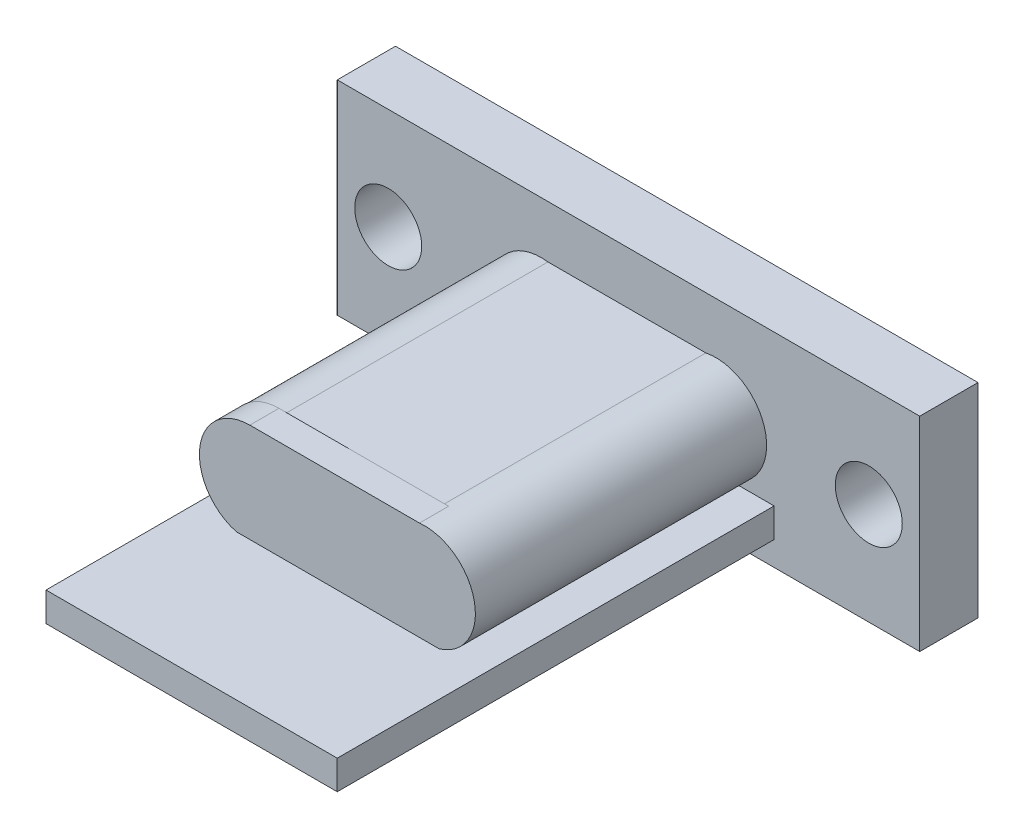
ISO-10303-21;
HEADER;
FILE_DESCRIPTION(('STEP AP214'),'2;1');
FILE_NAME('part.step','',(''),(''),'','','');
FILE_SCHEMA(('AUTOMOTIVE_DESIGN { 1 0 10303 214 1 1 1 1 }'));
ENDSEC;
DATA;
#1=APPLICATION_CONTEXT('core data for automotive mechanical design processes');
#2=APPLICATION_PROTOCOL_DEFINITION('international standard','automotive_design',2000,#1);
#3=PRODUCT_CONTEXT('',#1,'mechanical');
#4=PRODUCT('Part','Part','',(#3));
#5=PRODUCT_RELATED_PRODUCT_CATEGORY('part','',(#4));
#6=PRODUCT_DEFINITION_FORMATION('','',#4);
#7=PRODUCT_DEFINITION_CONTEXT('part definition',#1,'design');
#8=PRODUCT_DEFINITION('design','',#6,#7);
#9=PRODUCT_DEFINITION_SHAPE('','',#8);
#10=(LENGTH_UNIT() NAMED_UNIT(*) SI_UNIT(.MILLI.,.METRE.));
#11=(NAMED_UNIT(*) PLANE_ANGLE_UNIT() SI_UNIT($,.RADIAN.));
#12=(NAMED_UNIT(*) SI_UNIT($,.STERADIAN.) SOLID_ANGLE_UNIT());
#13=UNCERTAINTY_MEASURE_WITH_UNIT(LENGTH_MEASURE(1.E-05),#10,'distance_accuracy_value','');
#14=(GEOMETRIC_REPRESENTATION_CONTEXT(3) GLOBAL_UNCERTAINTY_ASSIGNED_CONTEXT((#13)) GLOBAL_UNIT_ASSIGNED_CONTEXT((#10,
#11,#12)) REPRESENTATION_CONTEXT('',''));
#15=CARTESIAN_POINT('',(0.,0.,0.));
#16=DIRECTION('',(0.,0.,1.));
#17=DIRECTION('',(1.,0.,0.));
#18=AXIS2_PLACEMENT_3D('',#15,#16,#17);
#19=CARTESIAN_POINT('',(7.,3.5,12.));
#20=DIRECTION('',(0.,0.,-1.));
#21=DIRECTION('',(-1.,0.,0.));
#22=AXIS2_PLACEMENT_3D('',#19,#20,#21);
#23=CYLINDRICAL_SURFACE('',#22,1.7179151626522);
#24=CARTESIAN_POINT('',(7.,3.5,11.));
#25=DIRECTION('',(0.,0.,1.));
#26=DIRECTION('',(1.,0.,0.));
#27=AXIS2_PLACEMENT_3D('',#24,#25,#26);
#28=CIRCLE('',#27,1.7179151626522);
#29=CARTESIAN_POINT('',(7.23314436267465,5.20202121379945,11.));
#30=VERTEX_POINT('',#29);
#31=CARTESIAN_POINT('',(6.59377962061956,1.8308033341016,11.));
#32=VERTEX_POINT('',#31);
#33=EDGE_CURVE('E272',#30,#32,#28,.T.);
#34=ORIENTED_EDGE('',*,*,#33,.F.);
#35=DIRECTION('',(0.,0.,-1.));
#36=VECTOR('',#35,1.);
#37=CARTESIAN_POINT('',(7.23314436267465,5.20202121379945,12.));
#38=LINE('',#37,#36);
#39=CARTESIAN_POINT('',(7.23314436267465,5.20202121379945,2.));
#40=VERTEX_POINT('',#39);
#41=EDGE_CURVE('E66',#30,#40,#38,.T.);
#42=ORIENTED_EDGE('',*,*,#41,.T.);
#43=CARTESIAN_POINT('',(7.,3.5,2.));
#44=DIRECTION('',(0.,0.,1.));
#45=DIRECTION('',(1.,0.,0.));
#46=AXIS2_PLACEMENT_3D('',#43,#44,#45);
#47=CIRCLE('',#46,1.7179151626522);
#48=CARTESIAN_POINT('',(6.59377962061956,1.8308033341016,2.));
#49=VERTEX_POINT('',#48);
#50=EDGE_CURVE('E307',#40,#49,#47,.T.);
#51=ORIENTED_EDGE('',*,*,#50,.T.);
#52=DIRECTION('',(0.,0.,-1.));
#53=VECTOR('',#52,1.);
#54=CARTESIAN_POINT('',(6.59377962061956,1.8308033341016,12.));
#55=LINE('',#54,#53);
#56=EDGE_CURVE('E358',#32,#49,#55,.T.);
#57=ORIENTED_EDGE('',*,*,#56,.F.);
#58=EDGE_LOOP('',(#34,#42,#51,#57));
#59=FACE_BOUND('',#58,.T.);
#60=ADVANCED_FACE('F44',(#59),#23,.T.);
#61=CARTESIAN_POINT('',(7.23314436267465,5.20202121379945,12.));
#62=DIRECTION('',(0.00101570335021365,-0.999999484173219,0.));
#63=DIRECTION('',(0.999999484173219,0.00101570335021365,0.));
#64=AXIS2_PLACEMENT_3D('',#61,#62,#63);
#65=PLANE('',#64);
#66=DIRECTION('',(-0.999999484173219,-0.00101570335021365,0.));
#67=VECTOR('',#66,1.);
#68=CARTESIAN_POINT('',(7.23314436267465,5.20202121379945,11.));
#69=LINE('',#68,#67);
#70=CARTESIAN_POINT('',(12.654720999838,5.20752793019377,11.));
#71=VERTEX_POINT('',#70);
#72=EDGE_CURVE('E270',#71,#30,#69,.T.);
#73=ORIENTED_EDGE('',*,*,#72,.F.);
#74=DIRECTION('',(0.,0.,-1.));
#75=VECTOR('',#74,1.);
#76=CARTESIAN_POINT('',(12.654720999838,5.20752793019377,12.));
#77=LINE('',#76,#75);
#78=CARTESIAN_POINT('',(12.654720999838,5.20752793019377,2.));
#79=VERTEX_POINT('',#78);
#80=EDGE_CURVE('E343',#71,#79,#77,.T.);
#81=ORIENTED_EDGE('',*,*,#80,.T.);
#82=DIRECTION('',(-0.999999484173219,-0.00101570335021365,0.));
#83=VECTOR('',#82,1.);
#84=CARTESIAN_POINT('',(7.23314436267465,5.20202121379945,2.));
#85=LINE('',#84,#83);
#86=EDGE_CURVE('E315',#79,#40,#85,.T.);
#87=ORIENTED_EDGE('',*,*,#86,.T.);
#88=ORIENTED_EDGE('',*,*,#41,.F.);
#89=EDGE_LOOP('',(#73,#81,#87,#88));
#90=FACE_BOUND('',#89,.T.);
#91=ADVANCED_FACE('F487',(#90),#65,.F.);
#92=CARTESIAN_POINT('',(7.,3.5,12.));
#93=DIRECTION('',(0.,0.,-1.));
#94=DIRECTION('',(-1.,0.,0.));
#95=AXIS2_PLACEMENT_3D('',#92,#93,#94);
#96=CYLINDRICAL_SURFACE('',#95,1.27);
#97=DIRECTION('',(0.,0.,-1.));
#98=VECTOR('',#97,1.);
#99=CARTESIAN_POINT('',(7.,4.77,12.));
#100=LINE('',#99,#98);
#101=CARTESIAN_POINT('',(7.,4.77,11.));
#102=VERTEX_POINT('',#101);
#103=CARTESIAN_POINT('',(7.,4.77,2.));
#104=VERTEX_POINT('',#103);
#105=EDGE_CURVE('E293',#102,#104,#100,.T.);
#106=ORIENTED_EDGE('',*,*,#105,.F.);
#107=CARTESIAN_POINT('',(7.,3.5,11.));
#108=DIRECTION('',(0.,0.,1.));
#109=DIRECTION('',(1.,0.,0.));
#110=AXIS2_PLACEMENT_3D('',#107,#108,#109);
#111=CIRCLE('',#110,1.27);
#112=CARTESIAN_POINT('',(7.,2.23,11.));
#113=VERTEX_POINT('',#112);
#114=EDGE_CURVE('E65',#102,#113,#111,.T.);
#115=ORIENTED_EDGE('',*,*,#114,.T.);
#116=DIRECTION('',(0.,0.,-1.));
#117=VECTOR('',#116,1.);
#118=CARTESIAN_POINT('',(7.,2.23,12.));
#119=LINE('',#118,#117);
#120=CARTESIAN_POINT('',(7.,2.23,2.));
#121=VERTEX_POINT('',#120);
#122=EDGE_CURVE('E305',#113,#121,#119,.T.);
#123=ORIENTED_EDGE('',*,*,#122,.T.);
#124=CARTESIAN_POINT('',(7.,3.5,2.));
#125=DIRECTION('',(0.,0.,1.));
#126=DIRECTION('',(1.,0.,0.));
#127=AXIS2_PLACEMENT_3D('',#124,#125,#126);
#128=CIRCLE('',#127,1.27);
#129=EDGE_CURVE('E276',#104,#121,#128,.T.);
#130=ORIENTED_EDGE('',*,*,#129,.F.);
#131=EDGE_LOOP('',(#106,#115,#123,#130));
#132=FACE_BOUND('',#131,.T.);
#133=ADVANCED_FACE('F511',(#132),#96,.F.);
#134=CARTESIAN_POINT('',(7.,2.23,12.));
#135=DIRECTION('',(0.,1.,0.));
#136=DIRECTION('',(0.,0.,1.));
#137=AXIS2_PLACEMENT_3D('',#134,#135,#136);
#138=PLANE('',#137);
#139=ORIENTED_EDGE('',*,*,#122,.F.);
#140=DIRECTION('',(1.,0.,0.));
#141=VECTOR('',#140,1.);
#142=CARTESIAN_POINT('',(7.,2.23,11.));
#143=LINE('',#142,#141);
#144=CARTESIAN_POINT('',(13.,2.23,11.));
#145=VERTEX_POINT('',#144);
#146=EDGE_CURVE('E261',#113,#145,#143,.T.);
#147=ORIENTED_EDGE('',*,*,#146,.T.);
#148=DIRECTION('',(0.,0.,-1.));
#149=VECTOR('',#148,1.);
#150=CARTESIAN_POINT('',(13.,2.23,12.));
#151=LINE('',#150,#149);
#152=CARTESIAN_POINT('',(13.,2.23,2.));
#153=VERTEX_POINT('',#152);
#154=EDGE_CURVE('E303',#145,#153,#151,.T.);
#155=ORIENTED_EDGE('',*,*,#154,.T.);
#156=DIRECTION('',(1.,0.,0.));
#157=VECTOR('',#156,1.);
#158=CARTESIAN_POINT('',(7.,2.23,2.));
#159=LINE('',#158,#157);
#160=EDGE_CURVE('E281',#121,#153,#159,.T.);
#161=ORIENTED_EDGE('',*,*,#160,.F.);
#162=EDGE_LOOP('',(#139,#147,#155,#161));
#163=FACE_BOUND('',#162,.T.);
#164=ADVANCED_FACE('F610',(#163),#138,.T.);
#165=CARTESIAN_POINT('',(13.,3.5,12.));
#166=DIRECTION('',(0.,0.,-1.));
#167=DIRECTION('',(-1.,0.,0.));
#168=AXIS2_PLACEMENT_3D('',#165,#166,#167);
#169=CYLINDRICAL_SURFACE('',#168,1.27);
#170=ORIENTED_EDGE('',*,*,#154,.F.);
#171=CARTESIAN_POINT('',(13.,3.5,11.));
#172=DIRECTION('',(0.,0.,1.));
#173=DIRECTION('',(1.,0.,0.));
#174=AXIS2_PLACEMENT_3D('',#171,#172,#173);
#175=CIRCLE('',#174,1.27);
#176=CARTESIAN_POINT('',(13.,4.77,11.));
#177=VERTEX_POINT('',#176);
#178=EDGE_CURVE('E260',#145,#177,#175,.T.);
#179=ORIENTED_EDGE('',*,*,#178,.T.);
#180=DIRECTION('',(0.,0.,-1.));
#181=VECTOR('',#180,1.);
#182=CARTESIAN_POINT('',(13.,4.77,12.));
#183=LINE('',#182,#181);
#184=CARTESIAN_POINT('',(13.,4.77,2.));
#185=VERTEX_POINT('',#184);
#186=EDGE_CURVE('E296',#177,#185,#183,.T.);
#187=ORIENTED_EDGE('',*,*,#186,.T.);
#188=CARTESIAN_POINT('',(13.,3.5,2.));
#189=DIRECTION('',(0.,0.,1.));
#190=DIRECTION('',(1.,0.,0.));
#191=AXIS2_PLACEMENT_3D('',#188,#189,#190);
#192=CIRCLE('',#191,1.27);
#193=EDGE_CURVE('E289',#153,#185,#192,.T.);
#194=ORIENTED_EDGE('',*,*,#193,.F.);
#195=EDGE_LOOP('',(#170,#179,#187,#194));
#196=FACE_BOUND('',#195,.T.);
#197=ADVANCED_FACE('F582',(#196),#169,.F.);
#198=CARTESIAN_POINT('',(7.,4.77,12.));
#199=DIRECTION('',(0.,-1.,0.));
#200=DIRECTION('',(0.,0.,-1.));
#201=AXIS2_PLACEMENT_3D('',#198,#199,#200);
#202=PLANE('',#201);
#203=ORIENTED_EDGE('',*,*,#186,.F.);
#204=DIRECTION('',(-1.,0.,0.));
#205=VECTOR('',#204,1.);
#206=CARTESIAN_POINT('',(7.,4.77,11.));
#207=LINE('',#206,#205);
#208=EDGE_CURVE('E458',#177,#102,#207,.T.);
#209=ORIENTED_EDGE('',*,*,#208,.T.);
#210=ORIENTED_EDGE('',*,*,#105,.T.);
#211=DIRECTION('',(-1.,0.,0.));
#212=VECTOR('',#211,1.);
#213=CARTESIAN_POINT('',(7.,4.77,2.));
#214=LINE('',#213,#212);
#215=EDGE_CURVE('E292',#185,#104,#214,.T.);
#216=ORIENTED_EDGE('',*,*,#215,.F.);
#217=EDGE_LOOP('',(#203,#209,#210,#216));
#218=FACE_BOUND('',#217,.T.);
#219=ADVANCED_FACE('F579',(#218),#202,.T.);
#220=CARTESIAN_POINT('',(0.,0.,2.));
#221=DIRECTION('',(0.,0.,-1.));
#222=DIRECTION('',(-1.,0.,0.));
#223=AXIS2_PLACEMENT_3D('',#220,#221,#222);
#224=PLANE('',#223);
#225=CARTESIAN_POINT('',(18.25,3.5,2.));
#226=DIRECTION('',(0.,0.,1.));
#227=DIRECTION('',(1.,0.,0.));
#228=AXIS2_PLACEMENT_3D('',#225,#226,#227);
#229=CIRCLE('',#228,1.15);
#230=CARTESIAN_POINT('',(19.4,3.5,2.));
#231=VERTEX_POINT('',#230);
#232=EDGE_CURVE('E401',#231,#231,#229,.T.);
#233=ORIENTED_EDGE('',*,*,#232,.F.);
#234=EDGE_LOOP('',(#233));
#235=FACE_BOUND('',#234,.T.);
#236=CARTESIAN_POINT('',(1.75,3.5,2.));
#237=DIRECTION('',(0.,0.,1.));
#238=DIRECTION('',(1.,0.,0.));
#239=AXIS2_PLACEMENT_3D('',#236,#237,#238);
#240=CIRCLE('',#239,1.15);
#241=CARTESIAN_POINT('',(2.9,3.5,2.));
#242=VERTEX_POINT('',#241);
#243=EDGE_CURVE('E413',#242,#242,#240,.T.);
#244=ORIENTED_EDGE('',*,*,#243,.F.);
#245=EDGE_LOOP('',(#244));
#246=FACE_BOUND('',#245,.T.);
#247=DIRECTION('',(0.,-1.,0.));
#248=VECTOR('',#247,1.);
#249=CARTESIAN_POINT('',(0.,0.,2.));
#250=LINE('',#249,#248);
#251=CARTESIAN_POINT('',(0.,7.,2.));
#252=VERTEX_POINT('',#251);
#253=CARTESIAN_POINT('',(0.,0.,2.));
#254=VERTEX_POINT('',#253);
#255=EDGE_CURVE('E420',#252,#254,#250,.T.);
#256=ORIENTED_EDGE('',*,*,#255,.T.);
#257=DIRECTION('',(1.,0.,0.));
#258=VECTOR('',#257,1.);
#259=CARTESIAN_POINT('',(0.,0.,2.));
#260=LINE('',#259,#258);
#261=CARTESIAN_POINT('',(20.,0.,2.));
#262=VERTEX_POINT('',#261);
#263=EDGE_CURVE('E421',#254,#262,#260,.T.);
#264=ORIENTED_EDGE('',*,*,#263,.T.);
#265=DIRECTION('',(0.,1.,0.));
#266=VECTOR('',#265,1.);
#267=CARTESIAN_POINT('',(20.,0.,2.));
#268=LINE('',#267,#266);
#269=CARTESIAN_POINT('',(20.,7.,2.));
#270=VERTEX_POINT('',#269);
#271=EDGE_CURVE('E430',#262,#270,#268,.T.);
#272=ORIENTED_EDGE('',*,*,#271,.T.);
#273=DIRECTION('',(-1.,0.,0.));
#274=VECTOR('',#273,1.);
#275=CARTESIAN_POINT('',(0.,7.,2.));
#276=LINE('',#275,#274);
#277=EDGE_CURVE('E429',#270,#252,#276,.T.);
#278=ORIENTED_EDGE('',*,*,#277,.T.);
#279=EDGE_LOOP('',(#256,#264,#272,#278));
#280=FACE_BOUND('',#279,.T.);
#281=ORIENTED_EDGE('',*,*,#50,.F.);
#282=ORIENTED_EDGE('',*,*,#86,.F.);
#283=CARTESIAN_POINT('',(13.,3.5,2.));
#284=DIRECTION('',(0.,0.,1.));
#285=DIRECTION('',(1.,0.,0.));
#286=AXIS2_PLACEMENT_3D('',#283,#284,#285);
#287=CIRCLE('',#286,1.74208760409594);
#288=CARTESIAN_POINT('',(13.4986498880962,1.8308033341016,2.));
#289=VERTEX_POINT('',#288);
#290=EDGE_CURVE('E335',#289,#79,#287,.T.);
#291=ORIENTED_EDGE('',*,*,#290,.F.);
#292=DIRECTION('',(-1.,0.,0.));
#293=VECTOR('',#292,1.);
#294=CARTESIAN_POINT('',(13.4986498880962,1.8308033341016,2.));
#295=LINE('',#294,#293);
#296=CARTESIAN_POINT('',(15.,1.8308033341016,2.));
#297=VERTEX_POINT('',#296);
#298=EDGE_CURVE('E327',#297,#289,#295,.T.);
#299=ORIENTED_EDGE('',*,*,#298,.F.);
#300=DIRECTION('',(0.,1.,0.));
#301=VECTOR('',#300,1.);
#302=CARTESIAN_POINT('',(15.,1.8308033341016,2.));
#303=LINE('',#302,#301);
#304=CARTESIAN_POINT('',(15.,0.830803334101598,2.));
#305=VERTEX_POINT('',#304);
#306=EDGE_CURVE('E322',#305,#297,#303,.T.);
#307=ORIENTED_EDGE('',*,*,#306,.F.);
#308=DIRECTION('',(1.,0.,0.));
#309=VECTOR('',#308,1.);
#310=CARTESIAN_POINT('',(5.,0.830803334101598,2.));
#311=LINE('',#310,#309);
#312=CARTESIAN_POINT('',(5.,0.830803334101598,2.));
#313=VERTEX_POINT('',#312);
#314=EDGE_CURVE('E321',#313,#305,#311,.T.);
#315=ORIENTED_EDGE('',*,*,#314,.F.);
#316=DIRECTION('',(0.,-1.,0.));
#317=VECTOR('',#316,1.);
#318=CARTESIAN_POINT('',(5.,1.8308033341016,2.));
#319=LINE('',#318,#317);
#320=CARTESIAN_POINT('',(5.,1.8308033341016,2.));
#321=VERTEX_POINT('',#320);
#322=EDGE_CURVE('E211',#321,#313,#319,.T.);
#323=ORIENTED_EDGE('',*,*,#322,.F.);
#324=DIRECTION('',(-1.,0.,0.));
#325=VECTOR('',#324,1.);
#326=CARTESIAN_POINT('',(5.,1.8308033341016,2.));
#327=LINE('',#326,#325);
#328=EDGE_CURVE('E312',#49,#321,#327,.T.);
#329=ORIENTED_EDGE('',*,*,#328,.F.);
#330=EDGE_LOOP('',(#281,#282,#291,#299,#307,#315,#323,#329));
#331=FACE_BOUND('',#330,.T.);
#332=ADVANCED_FACE('F492',(#235,#246,#280,#331),#224,.F.);
#333=ORIENTED_EDGE('',*,*,#215,.T.);
#334=ORIENTED_EDGE('',*,*,#129,.T.);
#335=ORIENTED_EDGE('',*,*,#160,.T.);
#336=ORIENTED_EDGE('',*,*,#193,.T.);
#337=EDGE_LOOP('',(#333,#334,#335,#336));
#338=FACE_BOUND('',#337,.T.);
#339=CARTESIAN_POINT('',(7.,3.5,2.));
#340=DIRECTION('',(0.,0.,1.));
#341=DIRECTION('',(1.,0.,0.));
#342=AXIS2_PLACEMENT_3D('',#339,#340,#341);
#343=CIRCLE('',#342,1.25);
#344=CARTESIAN_POINT('',(7.,4.75,2.));
#345=VERTEX_POINT('',#344);
#346=CARTESIAN_POINT('',(7.,2.25,2.));
#347=VERTEX_POINT('',#346);
#348=EDGE_CURVE('E356',#345,#347,#343,.T.);
#349=ORIENTED_EDGE('',*,*,#348,.F.);
#350=DIRECTION('',(-1.,0.,0.));
#351=VECTOR('',#350,1.);
#352=CARTESIAN_POINT('',(7.,4.75,2.));
#353=LINE('',#352,#351);
#354=CARTESIAN_POINT('',(13.,4.75,2.));
#355=VERTEX_POINT('',#354);
#356=EDGE_CURVE('E371',#355,#345,#353,.T.);
#357=ORIENTED_EDGE('',*,*,#356,.F.);
#358=CARTESIAN_POINT('',(13.,3.5,2.));
#359=DIRECTION('',(0.,0.,1.));
#360=DIRECTION('',(1.,0.,0.));
#361=AXIS2_PLACEMENT_3D('',#358,#359,#360);
#362=CIRCLE('',#361,1.25);
#363=CARTESIAN_POINT('',(13.,2.25,2.));
#364=VERTEX_POINT('',#363);
#365=EDGE_CURVE('E370',#364,#355,#362,.T.);
#366=ORIENTED_EDGE('',*,*,#365,.F.);
#367=DIRECTION('',(1.,0.,0.));
#368=VECTOR('',#367,1.);
#369=CARTESIAN_POINT('',(7.,2.25,2.));
#370=LINE('',#369,#368);
#371=EDGE_CURVE('E361',#347,#364,#370,.T.);
#372=ORIENTED_EDGE('',*,*,#371,.F.);
#373=EDGE_LOOP('',(#349,#357,#366,#372));
#374=FACE_BOUND('',#373,.T.);
#375=ADVANCED_FACE('F543',(#338,#374),#224,.F.);
#376=CARTESIAN_POINT('',(0.,0.,0.));
#377=DIRECTION('',(0.,0.,-1.));
#378=DIRECTION('',(-1.,0.,0.));
#379=AXIS2_PLACEMENT_3D('',#376,#377,#378);
#380=PLANE('',#379);
#381=CARTESIAN_POINT('',(1.75,3.5,0.));
#382=DIRECTION('',(0.,0.,1.));
#383=DIRECTION('',(1.,0.,0.));
#384=AXIS2_PLACEMENT_3D('',#381,#382,#383);
#385=CIRCLE('',#384,1.15);
#386=CARTESIAN_POINT('',(2.9,3.5,0.));
#387=VERTEX_POINT('',#386);
#388=EDGE_CURVE('E410',#387,#387,#385,.T.);
#389=ORIENTED_EDGE('',*,*,#388,.T.);
#390=EDGE_LOOP('',(#389));
#391=FACE_BOUND('',#390,.T.);
#392=DIRECTION('',(0.,-1.,0.));
#393=VECTOR('',#392,1.);
#394=CARTESIAN_POINT('',(0.,0.,0.));
#395=LINE('',#394,#393);
#396=CARTESIAN_POINT('',(0.,7.,0.));
#397=VERTEX_POINT('',#396);
#398=CARTESIAN_POINT('',(0.,0.,0.));
#399=VERTEX_POINT('',#398);
#400=EDGE_CURVE('E411',#397,#399,#395,.T.);
#401=ORIENTED_EDGE('',*,*,#400,.F.);
#402=DIRECTION('',(-1.,0.,0.));
#403=VECTOR('',#402,1.);
#404=CARTESIAN_POINT('',(0.,7.,0.));
#405=LINE('',#404,#403);
#406=CARTESIAN_POINT('',(20.,7.,0.));
#407=VERTEX_POINT('',#406);
#408=EDGE_CURVE('E424',#407,#397,#405,.T.);
#409=ORIENTED_EDGE('',*,*,#408,.F.);
#410=DIRECTION('',(0.,1.,0.));
#411=VECTOR('',#410,1.);
#412=CARTESIAN_POINT('',(20.,0.,0.));
#413=LINE('',#412,#411);
#414=CARTESIAN_POINT('',(20.,0.,0.));
#415=VERTEX_POINT('',#414);
#416=EDGE_CURVE('E439',#415,#407,#413,.T.);
#417=ORIENTED_EDGE('',*,*,#416,.F.);
#418=DIRECTION('',(1.,0.,0.));
#419=VECTOR('',#418,1.);
#420=CARTESIAN_POINT('',(0.,0.,0.));
#421=LINE('',#420,#419);
#422=EDGE_CURVE('E440',#399,#415,#421,.T.);
#423=ORIENTED_EDGE('',*,*,#422,.F.);
#424=EDGE_LOOP('',(#401,#409,#417,#423));
#425=FACE_BOUND('',#424,.T.);
#426=CARTESIAN_POINT('',(18.25,3.5,0.));
#427=DIRECTION('',(0.,0.,1.));
#428=DIRECTION('',(1.,0.,0.));
#429=AXIS2_PLACEMENT_3D('',#426,#427,#428);
#430=CIRCLE('',#429,1.15);
#431=CARTESIAN_POINT('',(19.4,3.5,0.));
#432=VERTEX_POINT('',#431);
#433=EDGE_CURVE('E405',#432,#432,#430,.T.);
#434=ORIENTED_EDGE('',*,*,#433,.T.);
#435=EDGE_LOOP('',(#434));
#436=FACE_BOUND('',#435,.T.);
#437=DIRECTION('',(-1.,0.,0.));
#438=VECTOR('',#437,1.);
#439=CARTESIAN_POINT('',(7.,4.75,0.));
#440=LINE('',#439,#438);
#441=CARTESIAN_POINT('',(13.,4.75,0.));
#442=VERTEX_POINT('',#441);
#443=CARTESIAN_POINT('',(7.,4.75,0.));
#444=VERTEX_POINT('',#443);
#445=EDGE_CURVE('E365',#442,#444,#440,.T.);
#446=ORIENTED_EDGE('',*,*,#445,.T.);
#447=CARTESIAN_POINT('',(7.,3.5,0.));
#448=DIRECTION('',(0.,0.,1.));
#449=DIRECTION('',(1.,0.,0.));
#450=AXIS2_PLACEMENT_3D('',#447,#448,#449);
#451=CIRCLE('',#450,1.25);
#452=CARTESIAN_POINT('',(7.,2.25,0.));
#453=VERTEX_POINT('',#452);
#454=EDGE_CURVE('E360',#444,#453,#451,.T.);
#455=ORIENTED_EDGE('',*,*,#454,.T.);
#456=DIRECTION('',(1.,0.,0.));
#457=VECTOR('',#456,1.);
#458=CARTESIAN_POINT('',(7.,2.25,0.));
#459=LINE('',#458,#457);
#460=CARTESIAN_POINT('',(13.,2.25,0.));
#461=VERTEX_POINT('',#460);
#462=EDGE_CURVE('E378',#453,#461,#459,.T.);
#463=ORIENTED_EDGE('',*,*,#462,.T.);
#464=CARTESIAN_POINT('',(13.,3.5,0.));
#465=DIRECTION('',(0.,0.,1.));
#466=DIRECTION('',(1.,0.,0.));
#467=AXIS2_PLACEMENT_3D('',#464,#465,#466);
#468=CIRCLE('',#467,1.25);
#469=EDGE_CURVE('E385',#461,#442,#468,.T.);
#470=ORIENTED_EDGE('',*,*,#469,.T.);
#471=EDGE_LOOP('',(#446,#455,#463,#470));
#472=FACE_BOUND('',#471,.T.);
#473=ADVANCED_FACE('F544',(#391,#425,#436,#472),#380,.T.);
#474=CARTESIAN_POINT('',(0.,0.,2.));
#475=DIRECTION('',(1.,0.,0.));
#476=DIRECTION('',(0.,0.,-1.));
#477=AXIS2_PLACEMENT_3D('',#474,#475,#476);
#478=PLANE('',#477);
#479=ORIENTED_EDGE('',*,*,#400,.T.);
#480=DIRECTION('',(0.,0.,-1.));
#481=VECTOR('',#480,1.);
#482=CARTESIAN_POINT('',(0.,0.,2.));
#483=LINE('',#482,#481);
#484=EDGE_CURVE('E457',#254,#399,#483,.T.);
#485=ORIENTED_EDGE('',*,*,#484,.F.);
#486=ORIENTED_EDGE('',*,*,#255,.F.);
#487=DIRECTION('',(0.,0.,-1.));
#488=VECTOR('',#487,1.);
#489=CARTESIAN_POINT('',(0.,7.,2.));
#490=LINE('',#489,#488);
#491=EDGE_CURVE('E433',#252,#397,#490,.T.);
#492=ORIENTED_EDGE('',*,*,#491,.T.);
#493=EDGE_LOOP('',(#479,#485,#486,#492));
#494=FACE_BOUND('',#493,.T.);
#495=ADVANCED_FACE('F50',(#494),#478,.F.);
#496=CARTESIAN_POINT('',(0.,0.,2.));
#497=DIRECTION('',(0.,1.,0.));
#498=DIRECTION('',(0.,0.,1.));
#499=AXIS2_PLACEMENT_3D('',#496,#497,#498);
#500=PLANE('',#499);
#501=ORIENTED_EDGE('',*,*,#422,.T.);
#502=DIRECTION('',(0.,0.,-1.));
#503=VECTOR('',#502,1.);
#504=CARTESIAN_POINT('',(20.,0.,2.));
#505=LINE('',#504,#503);
#506=EDGE_CURVE('E454',#262,#415,#505,.T.);
#507=ORIENTED_EDGE('',*,*,#506,.F.);
#508=ORIENTED_EDGE('',*,*,#263,.F.);
#509=ORIENTED_EDGE('',*,*,#484,.T.);
#510=EDGE_LOOP('',(#501,#507,#508,#509));
#511=FACE_BOUND('',#510,.T.);
#512=ADVANCED_FACE('F553',(#511),#500,.F.);
#513=CARTESIAN_POINT('',(20.,0.,2.));
#514=DIRECTION('',(-1.,0.,0.));
#515=DIRECTION('',(0.,0.,1.));
#516=AXIS2_PLACEMENT_3D('',#513,#514,#515);
#517=PLANE('',#516);
#518=ORIENTED_EDGE('',*,*,#416,.T.);
#519=DIRECTION('',(0.,0.,-1.));
#520=VECTOR('',#519,1.);
#521=CARTESIAN_POINT('',(20.,7.,2.));
#522=LINE('',#521,#520);
#523=EDGE_CURVE('E446',#270,#407,#522,.T.);
#524=ORIENTED_EDGE('',*,*,#523,.F.);
#525=ORIENTED_EDGE('',*,*,#271,.F.);
#526=ORIENTED_EDGE('',*,*,#506,.T.);
#527=EDGE_LOOP('',(#518,#524,#525,#526));
#528=FACE_BOUND('',#527,.T.);
#529=ADVANCED_FACE('F555',(#528),#517,.F.);
#530=CARTESIAN_POINT('',(0.,7.,2.));
#531=DIRECTION('',(0.,-1.,0.));
#532=DIRECTION('',(0.,0.,-1.));
#533=AXIS2_PLACEMENT_3D('',#530,#531,#532);
#534=PLANE('',#533);
#535=ORIENTED_EDGE('',*,*,#408,.T.);
#536=ORIENTED_EDGE('',*,*,#491,.F.);
#537=ORIENTED_EDGE('',*,*,#277,.F.);
#538=ORIENTED_EDGE('',*,*,#523,.T.);
#539=EDGE_LOOP('',(#535,#536,#537,#538));
#540=FACE_BOUND('',#539,.T.);
#541=ADVANCED_FACE('F541',(#540),#534,.F.);
#542=CARTESIAN_POINT('',(1.75,3.5,2.));
#543=DIRECTION('',(0.,0.,-1.));
#544=DIRECTION('',(-1.,0.,0.));
#545=AXIS2_PLACEMENT_3D('',#542,#543,#544);
#546=CYLINDRICAL_SURFACE('',#545,1.15);
#547=ORIENTED_EDGE('',*,*,#243,.T.);
#548=EDGE_LOOP('',(#547));
#549=FACE_BOUND('',#548,.T.);
#550=ORIENTED_EDGE('',*,*,#388,.F.);
#551=EDGE_LOOP('',(#550));
#552=FACE_BOUND('',#551,.T.);
#553=ADVANCED_FACE('F540',(#549,#552),#546,.F.);
#554=CARTESIAN_POINT('',(18.25,3.5,2.));
#555=DIRECTION('',(0.,0.,-1.));
#556=DIRECTION('',(-1.,0.,0.));
#557=AXIS2_PLACEMENT_3D('',#554,#555,#556);
#558=CYLINDRICAL_SURFACE('',#557,1.15);
#559=ORIENTED_EDGE('',*,*,#232,.T.);
#560=EDGE_LOOP('',(#559));
#561=FACE_BOUND('',#560,.T.);
#562=ORIENTED_EDGE('',*,*,#433,.F.);
#563=EDGE_LOOP('',(#562));
#564=FACE_BOUND('',#563,.T.);
#565=ADVANCED_FACE('F531',(#561,#564),#558,.F.);
#566=CARTESIAN_POINT('',(7.,3.5,2.));
#567=DIRECTION('',(0.,0.,-1.));
#568=DIRECTION('',(-1.,0.,0.));
#569=AXIS2_PLACEMENT_3D('',#566,#567,#568);
#570=CYLINDRICAL_SURFACE('',#569,1.25);
#571=ORIENTED_EDGE('',*,*,#454,.F.);
#572=DIRECTION('',(0.,0.,-1.));
#573=VECTOR('',#572,1.);
#574=CARTESIAN_POINT('',(7.,4.75,2.));
#575=LINE('',#574,#573);
#576=EDGE_CURVE('E372',#345,#444,#575,.T.);
#577=ORIENTED_EDGE('',*,*,#576,.F.);
#578=ORIENTED_EDGE('',*,*,#348,.T.);
#579=DIRECTION('',(0.,0.,-1.));
#580=VECTOR('',#579,1.);
#581=CARTESIAN_POINT('',(7.,2.25,2.));
#582=LINE('',#581,#580);
#583=EDGE_CURVE('E397',#347,#453,#582,.T.);
#584=ORIENTED_EDGE('',*,*,#583,.T.);
#585=EDGE_LOOP('',(#571,#577,#578,#584));
#586=FACE_BOUND('',#585,.T.);
#587=ADVANCED_FACE('F530',(#586),#570,.F.);
#588=CARTESIAN_POINT('',(7.,2.25,2.));
#589=DIRECTION('',(0.,1.,0.));
#590=DIRECTION('',(-1.,0.,0.));
#591=AXIS2_PLACEMENT_3D('',#588,#589,#590);
#592=PLANE('',#591);
#593=ORIENTED_EDGE('',*,*,#462,.F.);
#594=ORIENTED_EDGE('',*,*,#583,.F.);
#595=ORIENTED_EDGE('',*,*,#371,.T.);
#596=DIRECTION('',(0.,0.,-1.));
#597=VECTOR('',#596,1.);
#598=CARTESIAN_POINT('',(13.,2.25,2.));
#599=LINE('',#598,#597);
#600=EDGE_CURVE('E394',#364,#461,#599,.T.);
#601=ORIENTED_EDGE('',*,*,#600,.T.);
#602=EDGE_LOOP('',(#593,#594,#595,#601));
#603=FACE_BOUND('',#602,.T.);
#604=ADVANCED_FACE('F521',(#603),#592,.T.);
#605=CARTESIAN_POINT('',(13.,3.5,2.));
#606=DIRECTION('',(0.,0.,-1.));
#607=DIRECTION('',(-1.,0.,0.));
#608=AXIS2_PLACEMENT_3D('',#605,#606,#607);
#609=CYLINDRICAL_SURFACE('',#608,1.25);
#610=ORIENTED_EDGE('',*,*,#469,.F.);
#611=ORIENTED_EDGE('',*,*,#600,.F.);
#612=ORIENTED_EDGE('',*,*,#365,.T.);
#613=DIRECTION('',(0.,0.,-1.));
#614=VECTOR('',#613,1.);
#615=CARTESIAN_POINT('',(13.,4.75,2.));
#616=LINE('',#615,#614);
#617=EDGE_CURVE('E395',#355,#442,#616,.T.);
#618=ORIENTED_EDGE('',*,*,#617,.T.);
#619=EDGE_LOOP('',(#610,#611,#612,#618));
#620=FACE_BOUND('',#619,.T.);
#621=ADVANCED_FACE('F523',(#620),#609,.F.);
#622=CARTESIAN_POINT('',(7.,4.75,2.));
#623=DIRECTION('',(0.,-1.,0.));
#624=DIRECTION('',(1.,0.,0.));
#625=AXIS2_PLACEMENT_3D('',#622,#623,#624);
#626=PLANE('',#625);
#627=ORIENTED_EDGE('',*,*,#445,.F.);
#628=ORIENTED_EDGE('',*,*,#617,.F.);
#629=ORIENTED_EDGE('',*,*,#356,.T.);
#630=ORIENTED_EDGE('',*,*,#576,.T.);
#631=EDGE_LOOP('',(#627,#628,#629,#630));
#632=FACE_BOUND('',#631,.T.);
#633=ADVANCED_FACE('F516',(#632),#626,.T.);
#634=CARTESIAN_POINT('',(7.,3.5,12.));
#635=DIRECTION('',(0.,0.,1.));
#636=DIRECTION('',(1.,0.,0.));
#637=AXIS2_PLACEMENT_3D('',#634,#635,#636);
#638=PLANE('',#637);
#639=DIRECTION('',(-1.,0.,0.));
#640=VECTOR('',#639,1.);
#641=CARTESIAN_POINT('',(5.,1.8308033341016,12.));
#642=LINE('',#641,#640);
#643=CARTESIAN_POINT('',(13.4986498880962,1.8308033341016,12.));
#644=VERTEX_POINT('',#643);
#645=CARTESIAN_POINT('',(6.53386503358045,1.8308033341016,12.));
#646=VERTEX_POINT('',#645);
#647=EDGE_CURVE('E11',#644,#646,#642,.T.);
#648=ORIENTED_EDGE('',*,*,#647,.F.);
#649=CARTESIAN_POINT('',(13.,3.5,12.));
#650=DIRECTION('',(0.,0.,1.));
#651=DIRECTION('',(1.,0.,0.));
#652=AXIS2_PLACEMENT_3D('',#649,#650,#651);
#653=CIRCLE('',#652,1.74208760409594);
#654=CARTESIAN_POINT('',(12.8228844897265,5.2330606787892,12.));
#655=VERTEX_POINT('',#654);
#656=EDGE_CURVE('E306',#644,#655,#653,.T.);
#657=ORIENTED_EDGE('',*,*,#656,.T.);
#658=DIRECTION('',(-1.,0.,0.));
#659=VECTOR('',#658,1.);
#660=CARTESIAN_POINT('',(7.,5.2330606787892,12.));
#661=LINE('',#660,#659);
#662=CARTESIAN_POINT('',(7.,5.2330606787892,12.));
#663=VERTEX_POINT('',#662);
#664=EDGE_CURVE('E244',#655,#663,#661,.T.);
#665=ORIENTED_EDGE('',*,*,#664,.T.);
#666=CARTESIAN_POINT('',(7.,3.5,12.));
#667=DIRECTION('',(0.,0.,1.));
#668=DIRECTION('',(1.,0.,0.));
#669=AXIS2_PLACEMENT_3D('',#666,#667,#668);
#670=CIRCLE('',#669,1.7330606787892);
#671=EDGE_CURVE('E236',#663,#646,#670,.T.);
#672=ORIENTED_EDGE('',*,*,#671,.T.);
#673=EDGE_LOOP('',(#648,#657,#665,#672));
#674=FACE_BOUND('',#673,.T.);
#675=ADVANCED_FACE('F481',(#674),#638,.T.);
#676=CARTESIAN_POINT('',(5.,1.8308033341016,12.));
#677=DIRECTION('',(0.,-1.,0.));
#678=DIRECTION('',(0.,0.,-1.));
#679=AXIS2_PLACEMENT_3D('',#676,#677,#678);
#680=PLANE('',#679);
#681=DIRECTION('',(0.,0.,-1.));
#682=VECTOR('',#681,1.);
#683=CARTESIAN_POINT('',(5.,1.8308033341016,12.));
#684=LINE('',#683,#682);
#685=CARTESIAN_POINT('',(5.,1.8308033341016,17.));
#686=VERTEX_POINT('',#685);
#687=EDGE_CURVE('E214',#686,#321,#684,.T.);
#688=ORIENTED_EDGE('',*,*,#687,.F.);
#689=DIRECTION('',(-1.,0.,0.));
#690=VECTOR('',#689,1.);
#691=CARTESIAN_POINT('',(5.,1.8308033341016,17.));
#692=LINE('',#691,#690);
#693=CARTESIAN_POINT('',(15.,1.8308033341016,17.));
#694=VERTEX_POINT('',#693);
#695=EDGE_CURVE('E233',#694,#686,#692,.T.);
#696=ORIENTED_EDGE('',*,*,#695,.F.);
#697=DIRECTION('',(0.,0.,-1.));
#698=VECTOR('',#697,1.);
#699=CARTESIAN_POINT('',(15.,1.8308033341016,12.));
#700=LINE('',#699,#698);
#701=EDGE_CURVE('E346',#694,#297,#700,.T.);
#702=ORIENTED_EDGE('',*,*,#701,.T.);
#703=ORIENTED_EDGE('',*,*,#298,.T.);
#704=DIRECTION('',(0.,0.,-1.));
#705=VECTOR('',#704,1.);
#706=CARTESIAN_POINT('',(13.4986498880962,1.8308033341016,12.));
#707=LINE('',#706,#705);
#708=EDGE_CURVE('E345',#644,#289,#707,.T.);
#709=ORIENTED_EDGE('',*,*,#708,.F.);
#710=ORIENTED_EDGE('',*,*,#647,.T.);
#711=DIRECTION('',(0.,0.,1.));
#712=VECTOR('',#711,1.);
#713=CARTESIAN_POINT('',(6.53386503358045,1.8308033341016,11.));
#714=LINE('',#713,#712);
#715=CARTESIAN_POINT('',(6.53386503358045,1.8308033341016,11.));
#716=VERTEX_POINT('',#715);
#717=EDGE_CURVE('E47',#646,#716,#714,.F.);
#718=ORIENTED_EDGE('',*,*,#717,.T.);
#719=DIRECTION('',(-1.,0.,0.));
#720=VECTOR('',#719,1.);
#721=CARTESIAN_POINT('',(5.,1.8308033341016,11.));
#722=LINE('',#721,#720);
#723=EDGE_CURVE('E277',#32,#716,#722,.T.);
#724=ORIENTED_EDGE('',*,*,#723,.F.);
#725=ORIENTED_EDGE('',*,*,#56,.T.);
#726=ORIENTED_EDGE('',*,*,#328,.T.);
#727=EDGE_LOOP('',(#688,#696,#702,#703,#709,#710,#718,#724,#725,#726));
#728=FACE_BOUND('',#727,.T.);
#729=ADVANCED_FACE('F472',(#728),#680,.F.);
#730=CARTESIAN_POINT('',(5.,1.8308033341016,12.));
#731=DIRECTION('',(1.,0.,0.));
#732=DIRECTION('',(0.,0.,-1.));
#733=AXIS2_PLACEMENT_3D('',#730,#731,#732);
#734=PLANE('',#733);
#735=ORIENTED_EDGE('',*,*,#322,.T.);
#736=DIRECTION('',(0.,0.,-1.));
#737=VECTOR('',#736,1.);
#738=CARTESIAN_POINT('',(5.,0.830803334101598,12.));
#739=LINE('',#738,#737);
#740=CARTESIAN_POINT('',(5.,0.830803334101598,17.));
#741=VERTEX_POINT('',#740);
#742=EDGE_CURVE('E202',#741,#313,#739,.T.);
#743=ORIENTED_EDGE('',*,*,#742,.F.);
#744=DIRECTION('',(0.,-1.,0.));
#745=VECTOR('',#744,1.);
#746=CARTESIAN_POINT('',(5.,1.8308033341016,17.));
#747=LINE('',#746,#745);
#748=EDGE_CURVE('E209',#686,#741,#747,.T.);
#749=ORIENTED_EDGE('',*,*,#748,.F.);
#750=ORIENTED_EDGE('',*,*,#687,.T.);
#751=EDGE_LOOP('',(#735,#743,#749,#750));
#752=FACE_BOUND('',#751,.T.);
#753=ADVANCED_FACE('F210',(#752),#734,.F.);
#754=CARTESIAN_POINT('',(5.,0.830803334101598,12.));
#755=DIRECTION('',(0.,1.,0.));
#756=DIRECTION('',(0.,0.,1.));
#757=AXIS2_PLACEMENT_3D('',#754,#755,#756);
#758=PLANE('',#757);
#759=ORIENTED_EDGE('',*,*,#314,.T.);
#760=DIRECTION('',(0.,0.,-1.));
#761=VECTOR('',#760,1.);
#762=CARTESIAN_POINT('',(15.,0.830803334101598,12.));
#763=LINE('',#762,#761);
#764=CARTESIAN_POINT('',(15.,0.830803334101598,17.));
#765=VERTEX_POINT('',#764);
#766=EDGE_CURVE('E216',#765,#305,#763,.T.);
#767=ORIENTED_EDGE('',*,*,#766,.F.);
#768=DIRECTION('',(1.,0.,0.));
#769=VECTOR('',#768,1.);
#770=CARTESIAN_POINT('',(5.,0.830803334101598,17.));
#771=LINE('',#770,#769);
#772=EDGE_CURVE('E218',#741,#765,#771,.T.);
#773=ORIENTED_EDGE('',*,*,#772,.F.);
#774=ORIENTED_EDGE('',*,*,#742,.T.);
#775=EDGE_LOOP('',(#759,#767,#773,#774));
#776=FACE_BOUND('',#775,.T.);
#777=ADVANCED_FACE('F219',(#776),#758,.F.);
#778=CARTESIAN_POINT('',(15.,1.8308033341016,12.));
#779=DIRECTION('',(-1.,0.,0.));
#780=DIRECTION('',(0.,0.,1.));
#781=AXIS2_PLACEMENT_3D('',#778,#779,#780);
#782=PLANE('',#781);
#783=ORIENTED_EDGE('',*,*,#306,.T.);
#784=ORIENTED_EDGE('',*,*,#701,.F.);
#785=DIRECTION('',(0.,1.,0.));
#786=VECTOR('',#785,1.);
#787=CARTESIAN_POINT('',(15.,1.8308033341016,17.));
#788=LINE('',#787,#786);
#789=EDGE_CURVE('E228',#765,#694,#788,.T.);
#790=ORIENTED_EDGE('',*,*,#789,.F.);
#791=ORIENTED_EDGE('',*,*,#766,.T.);
#792=EDGE_LOOP('',(#783,#784,#790,#791));
#793=FACE_BOUND('',#792,.T.);
#794=ADVANCED_FACE('F500',(#793),#782,.F.);
#795=CARTESIAN_POINT('',(13.,3.5,12.));
#796=DIRECTION('',(0.,0.,-1.));
#797=DIRECTION('',(-1.,0.,0.));
#798=AXIS2_PLACEMENT_3D('',#795,#796,#797);
#799=CYLINDRICAL_SURFACE('',#798,1.74208760409594);
#800=CARTESIAN_POINT('',(13.,3.5,11.));
#801=DIRECTION('',(0.,0.,1.));
#802=DIRECTION('',(1.,0.,0.));
#803=AXIS2_PLACEMENT_3D('',#800,#801,#802);
#804=CIRCLE('',#803,1.74208760409594);
#805=CARTESIAN_POINT('',(12.8228844897265,5.2330606787892,11.));
#806=VERTEX_POINT('',#805);
#807=EDGE_CURVE('E269',#806,#71,#804,.T.);
#808=ORIENTED_EDGE('',*,*,#807,.F.);
#809=DIRECTION('',(0.,0.,-1.));
#810=VECTOR('',#809,1.);
#811=CARTESIAN_POINT('',(12.8228844897265,5.2330606787892,12.));
#812=LINE('',#811,#810);
#813=EDGE_CURVE('E465',#806,#655,#812,.F.);
#814=ORIENTED_EDGE('',*,*,#813,.T.);
#815=ORIENTED_EDGE('',*,*,#656,.F.);
#816=ORIENTED_EDGE('',*,*,#708,.T.);
#817=ORIENTED_EDGE('',*,*,#290,.T.);
#818=ORIENTED_EDGE('',*,*,#80,.F.);
#819=EDGE_LOOP('',(#808,#814,#815,#816,#817,#818));
#820=FACE_BOUND('',#819,.T.);
#821=ADVANCED_FACE('F494',(#820),#799,.T.);
#822=CARTESIAN_POINT('',(7.,3.5,11.));
#823=DIRECTION('',(0.,0.,1.));
#824=DIRECTION('',(1.,0.,0.));
#825=AXIS2_PLACEMENT_3D('',#822,#823,#824);
#826=PLANE('',#825);
#827=ORIENTED_EDGE('',*,*,#114,.F.);
#828=ORIENTED_EDGE('',*,*,#208,.F.);
#829=ORIENTED_EDGE('',*,*,#178,.F.);
#830=ORIENTED_EDGE('',*,*,#146,.F.);
#831=EDGE_LOOP('',(#827,#828,#829,#830));
#832=FACE_BOUND('',#831,.T.);
#833=ADVANCED_FACE('F502',(#832),#826,.F.);
#834=CARTESIAN_POINT('',(7.,3.5,11.));
#835=DIRECTION('',(0.,0.,1.));
#836=DIRECTION('',(1.,0.,0.));
#837=AXIS2_PLACEMENT_3D('',#834,#835,#836);
#838=CYLINDRICAL_SURFACE('',#837,1.7330606787892);
#839=ORIENTED_EDGE('',*,*,#717,.F.);
#840=ORIENTED_EDGE('',*,*,#671,.F.);
#841=DIRECTION('',(0.,0.,1.));
#842=VECTOR('',#841,1.);
#843=CARTESIAN_POINT('',(7.,5.2330606787892,11.));
#844=LINE('',#843,#842);
#845=CARTESIAN_POINT('',(7.,5.2330606787892,11.));
#846=VERTEX_POINT('',#845);
#847=EDGE_CURVE('E247',#846,#663,#844,.T.);
#848=ORIENTED_EDGE('',*,*,#847,.F.);
#849=CARTESIAN_POINT('',(7.,3.5,11.));
#850=DIRECTION('',(0.,0.,1.));
#851=DIRECTION('',(1.,0.,0.));
#852=AXIS2_PLACEMENT_3D('',#849,#850,#851);
#853=CIRCLE('',#852,1.7330606787892);
#854=EDGE_CURVE('E238',#846,#716,#853,.T.);
#855=ORIENTED_EDGE('',*,*,#854,.T.);
#856=EDGE_LOOP('',(#839,#840,#848,#855));
#857=FACE_BOUND('',#856,.T.);
#858=ADVANCED_FACE('F480',(#857),#838,.T.);
#859=CARTESIAN_POINT('',(7.,5.2330606787892,11.));
#860=DIRECTION('',(0.,1.,0.));
#861=DIRECTION('',(0.,0.,1.));
#862=AXIS2_PLACEMENT_3D('',#859,#860,#861);
#863=PLANE('',#862);
#864=ORIENTED_EDGE('',*,*,#813,.F.);
#865=DIRECTION('',(-1.,0.,0.));
#866=VECTOR('',#865,1.);
#867=CARTESIAN_POINT('',(7.,5.2330606787892,11.));
#868=LINE('',#867,#866);
#869=EDGE_CURVE('E242',#806,#846,#868,.T.);
#870=ORIENTED_EDGE('',*,*,#869,.T.);
#871=ORIENTED_EDGE('',*,*,#847,.T.);
#872=ORIENTED_EDGE('',*,*,#664,.F.);
#873=EDGE_LOOP('',(#864,#870,#871,#872));
#874=FACE_BOUND('',#873,.T.);
#875=ADVANCED_FACE('F483',(#874),#863,.T.);
#876=ORIENTED_EDGE('',*,*,#33,.T.);
#877=ORIENTED_EDGE('',*,*,#723,.T.);
#878=ORIENTED_EDGE('',*,*,#854,.F.);
#879=ORIENTED_EDGE('',*,*,#869,.F.);
#880=ORIENTED_EDGE('',*,*,#807,.T.);
#881=ORIENTED_EDGE('',*,*,#72,.T.);
#882=EDGE_LOOP('',(#876,#877,#878,#879,#880,#881));
#883=FACE_BOUND('',#882,.T.);
#884=ADVANCED_FACE('F486',(#883),#826,.F.);
#885=CARTESIAN_POINT('',(0.,0.,17.));
#886=DIRECTION('',(0.,0.,1.));
#887=DIRECTION('',(1.,0.,0.));
#888=AXIS2_PLACEMENT_3D('',#885,#886,#887);
#889=PLANE('',#888);
#890=ORIENTED_EDGE('',*,*,#748,.T.);
#891=ORIENTED_EDGE('',*,*,#772,.T.);
#892=ORIENTED_EDGE('',*,*,#789,.T.);
#893=ORIENTED_EDGE('',*,*,#695,.T.);
#894=EDGE_LOOP('',(#890,#891,#892,#893));
#895=FACE_BOUND('',#894,.T.);
#896=ADVANCED_FACE('F227',(#895),#889,.T.);
#897=CLOSED_SHELL('',(#60,#91,#133,#164,#197,#219,#332,#375,#473,#495,#512,#529,#541,#553,#565,
#587,#604,#621,#633,#675,#729,#753,#777,#794,#821,#833,#858,#875,#884,#896));
#898=MANIFOLD_SOLID_BREP('B2',#897);
#899=ADVANCED_BREP_SHAPE_REPRESENTATION('',(#18,#898),#14);
#900=SHAPE_DEFINITION_REPRESENTATION(#9,#899);
ENDSEC;
END-ISO-10303-21;
